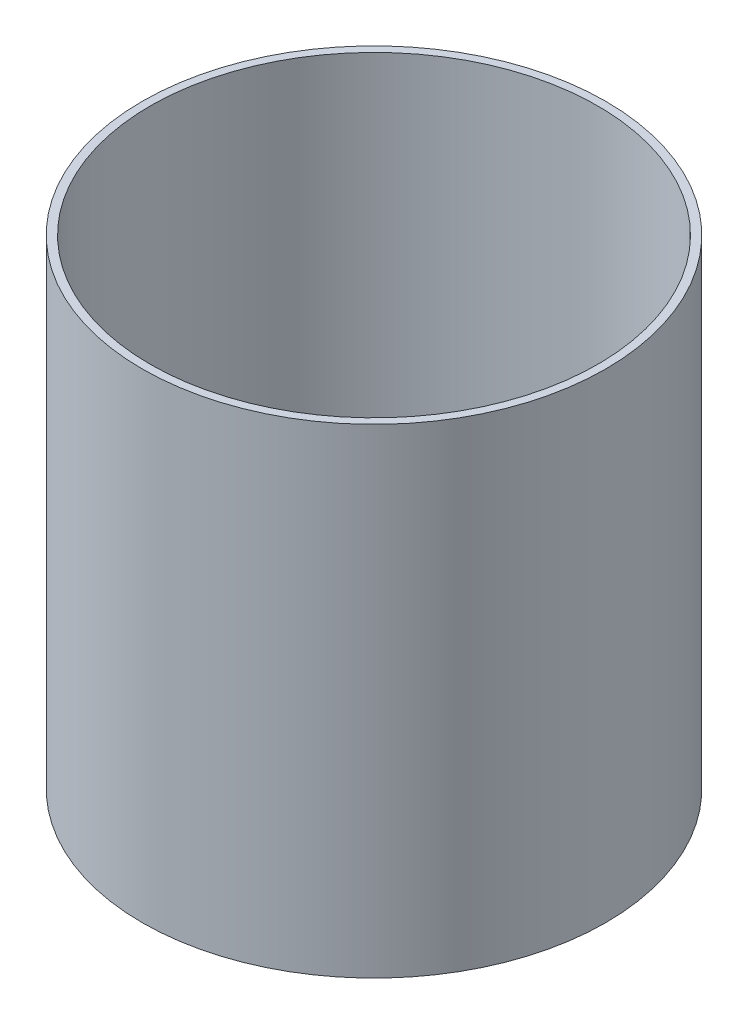
ISO-10303-21;
HEADER;
FILE_DESCRIPTION(('STEP AP214'),'2;1');
FILE_NAME('part.step','',(''),(''),'','','');
FILE_SCHEMA(('AUTOMOTIVE_DESIGN { 1 0 10303 214 1 1 1 1 }'));
ENDSEC;
DATA;
#1=APPLICATION_CONTEXT('core data for automotive mechanical design processes');
#2=APPLICATION_PROTOCOL_DEFINITION('international standard','automotive_design',2000,#1);
#3=PRODUCT_CONTEXT('',#1,'mechanical');
#4=PRODUCT('Part','Part','',(#3));
#5=PRODUCT_RELATED_PRODUCT_CATEGORY('part','',(#4));
#6=PRODUCT_DEFINITION_FORMATION('','',#4);
#7=PRODUCT_DEFINITION_CONTEXT('part definition',#1,'design');
#8=PRODUCT_DEFINITION('design','',#6,#7);
#9=PRODUCT_DEFINITION_SHAPE('','',#8);
#10=(LENGTH_UNIT() NAMED_UNIT(*) SI_UNIT(.MILLI.,.METRE.));
#11=(NAMED_UNIT(*) PLANE_ANGLE_UNIT() SI_UNIT($,.RADIAN.));
#12=(NAMED_UNIT(*) SI_UNIT($,.STERADIAN.) SOLID_ANGLE_UNIT());
#13=UNCERTAINTY_MEASURE_WITH_UNIT(LENGTH_MEASURE(1.E-05),#10,'distance_accuracy_value','');
#14=(GEOMETRIC_REPRESENTATION_CONTEXT(3) GLOBAL_UNCERTAINTY_ASSIGNED_CONTEXT((#13)) GLOBAL_UNIT_ASSIGNED_CONTEXT((#10,
#11,#12)) REPRESENTATION_CONTEXT('',''));
#15=CARTESIAN_POINT('',(0.,0.,0.));
#16=DIRECTION('',(0.,0.,1.));
#17=DIRECTION('',(1.,0.,0.));
#18=AXIS2_PLACEMENT_3D('',#15,#16,#17);
#19=CARTESIAN_POINT('',(0.,300.,0.));
#20=DIRECTION('',(0.,1.,0.));
#21=DIRECTION('',(0.,0.,1.));
#22=AXIS2_PLACEMENT_3D('',#19,#20,#21);
#23=PLANE('',#22);
#24=CARTESIAN_POINT('',(0.,300.,0.));
#25=DIRECTION('',(0.,1.,0.));
#26=DIRECTION('',(0.,0.,1.));
#27=AXIS2_PLACEMENT_3D('',#24,#25,#26);
#28=CIRCLE('',#27,145.);
#29=CARTESIAN_POINT('',(0.,300.,145.));
#30=VERTEX_POINT('',#29);
#31=EDGE_CURVE('E10',#30,#30,#28,.T.);
#32=ORIENTED_EDGE('',*,*,#31,.T.);
#33=EDGE_LOOP('',(#32));
#34=FACE_BOUND('',#33,.T.);
#35=CARTESIAN_POINT('',(0.,300.,0.));
#36=DIRECTION('',(0.,1.,0.));
#37=DIRECTION('',(0.,0.,1.));
#38=AXIS2_PLACEMENT_3D('',#35,#36,#37);
#39=CIRCLE('',#38,140.);
#40=CARTESIAN_POINT('',(0.,300.,140.));
#41=VERTEX_POINT('',#40);
#42=EDGE_CURVE('E62',#41,#41,#39,.T.);
#43=ORIENTED_EDGE('',*,*,#42,.F.);
#44=EDGE_LOOP('',(#43));
#45=FACE_BOUND('',#44,.T.);
#46=ADVANCED_FACE('F49',(#34,#45),#23,.T.);
#47=CARTESIAN_POINT('',(0.,0.,0.));
#48=DIRECTION('',(0.,1.,0.));
#49=DIRECTION('',(0.,0.,1.));
#50=AXIS2_PLACEMENT_3D('',#47,#48,#49);
#51=PLANE('',#50);
#52=CARTESIAN_POINT('',(0.,0.,0.));
#53=DIRECTION('',(0.,1.,0.));
#54=DIRECTION('',(0.,0.,1.));
#55=AXIS2_PLACEMENT_3D('',#52,#53,#54);
#56=CIRCLE('',#55,145.);
#57=CARTESIAN_POINT('',(0.,0.,145.));
#58=VERTEX_POINT('',#57);
#59=EDGE_CURVE('E53',#58,#58,#56,.T.);
#60=ORIENTED_EDGE('',*,*,#59,.F.);
#61=EDGE_LOOP('',(#60));
#62=FACE_BOUND('',#61,.T.);
#63=CARTESIAN_POINT('',(0.,0.,0.));
#64=DIRECTION('',(0.,1.,0.));
#65=DIRECTION('',(0.,0.,1.));
#66=AXIS2_PLACEMENT_3D('',#63,#64,#65);
#67=CIRCLE('',#66,140.);
#68=CARTESIAN_POINT('',(0.,0.,140.));
#69=VERTEX_POINT('',#68);
#70=EDGE_CURVE('E64',#69,#69,#67,.T.);
#71=ORIENTED_EDGE('',*,*,#70,.T.);
#72=EDGE_LOOP('',(#71));
#73=FACE_BOUND('',#72,.T.);
#74=ADVANCED_FACE('F76',(#62,#73),#51,.F.);
#75=CARTESIAN_POINT('',(0.,300.,0.));
#76=DIRECTION('',(0.,-1.,0.));
#77=DIRECTION('',(0.,0.,-1.));
#78=AXIS2_PLACEMENT_3D('',#75,#76,#77);
#79=CYLINDRICAL_SURFACE('',#78,145.);
#80=ORIENTED_EDGE('',*,*,#31,.F.);
#81=EDGE_LOOP('',(#80));
#82=FACE_BOUND('',#81,.T.);
#83=ORIENTED_EDGE('',*,*,#59,.T.);
#84=EDGE_LOOP('',(#83));
#85=FACE_BOUND('',#84,.T.);
#86=ADVANCED_FACE('F51',(#82,#85),#79,.T.);
#87=CARTESIAN_POINT('',(0.,300.,0.));
#88=DIRECTION('',(0.,-1.,0.));
#89=DIRECTION('',(0.,0.,-1.));
#90=AXIS2_PLACEMENT_3D('',#87,#88,#89);
#91=CYLINDRICAL_SURFACE('',#90,140.);
#92=ORIENTED_EDGE('',*,*,#42,.T.);
#93=EDGE_LOOP('',(#92));
#94=FACE_BOUND('',#93,.T.);
#95=ORIENTED_EDGE('',*,*,#70,.F.);
#96=EDGE_LOOP('',(#95));
#97=FACE_BOUND('',#96,.T.);
#98=ADVANCED_FACE('F72',(#94,#97),#91,.F.);
#99=CLOSED_SHELL('',(#46,#74,#86,#98));
#100=MANIFOLD_SOLID_BREP('B2',#99);
#101=ADVANCED_BREP_SHAPE_REPRESENTATION('',(#18,#100),#14);
#102=SHAPE_DEFINITION_REPRESENTATION(#9,#101);
ENDSEC;
END-ISO-10303-21;
